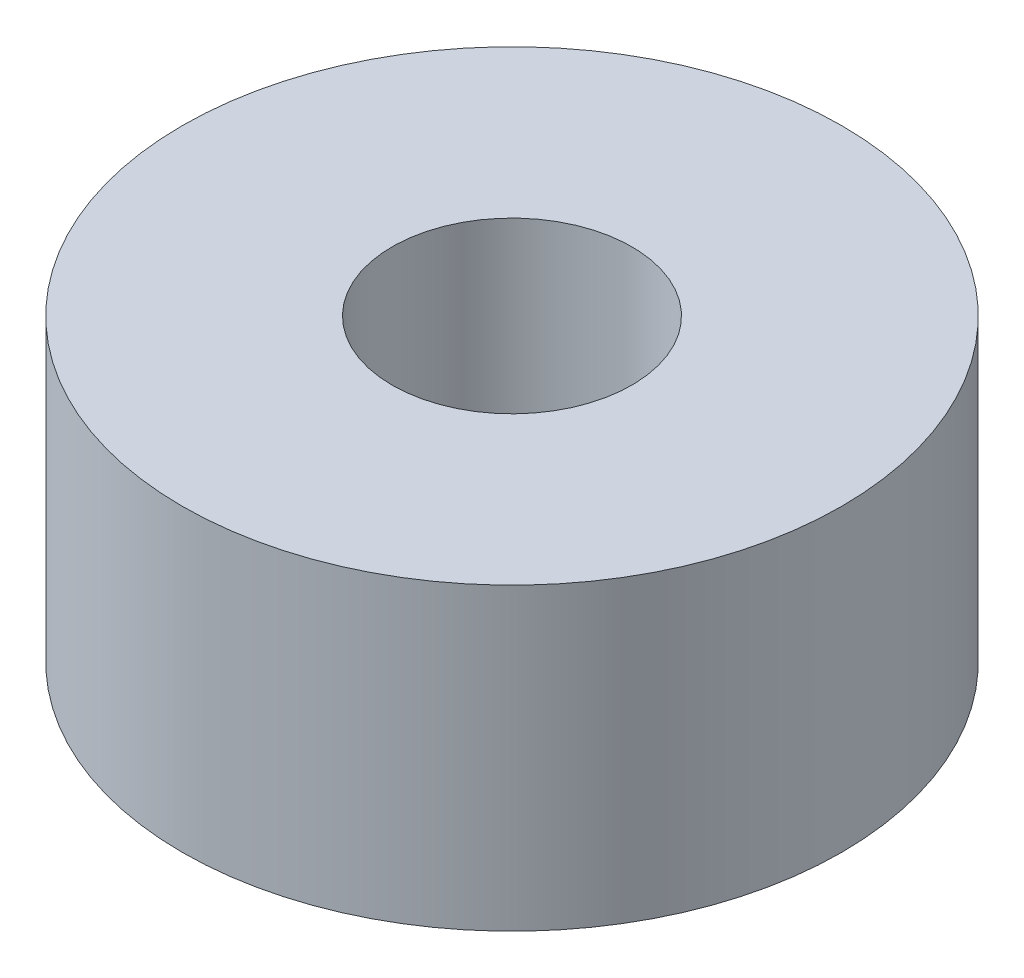
ISO-10303-21;
HEADER;
FILE_DESCRIPTION(('STEP AP214'),'2;1');
FILE_NAME('part.step','',(''),(''),'','','');
FILE_SCHEMA(('AUTOMOTIVE_DESIGN { 1 0 10303 214 1 1 1 1 }'));
ENDSEC;
DATA;
#1=APPLICATION_CONTEXT('core data for automotive mechanical design processes');
#2=APPLICATION_PROTOCOL_DEFINITION('international standard','automotive_design',2000,#1);
#3=PRODUCT_CONTEXT('',#1,'mechanical');
#4=PRODUCT('Part','Part','',(#3));
#5=PRODUCT_RELATED_PRODUCT_CATEGORY('part','',(#4));
#6=PRODUCT_DEFINITION_FORMATION('','',#4);
#7=PRODUCT_DEFINITION_CONTEXT('part definition',#1,'design');
#8=PRODUCT_DEFINITION('design','',#6,#7);
#9=PRODUCT_DEFINITION_SHAPE('','',#8);
#10=(LENGTH_UNIT() NAMED_UNIT(*) SI_UNIT(.MILLI.,.METRE.));
#11=(NAMED_UNIT(*) PLANE_ANGLE_UNIT() SI_UNIT($,.RADIAN.));
#12=(NAMED_UNIT(*) SI_UNIT($,.STERADIAN.) SOLID_ANGLE_UNIT());
#13=UNCERTAINTY_MEASURE_WITH_UNIT(LENGTH_MEASURE(1.E-05),#10,'distance_accuracy_value','');
#14=(GEOMETRIC_REPRESENTATION_CONTEXT(3) GLOBAL_UNCERTAINTY_ASSIGNED_CONTEXT((#13)) GLOBAL_UNIT_ASSIGNED_CONTEXT((#10,
#11,#12)) REPRESENTATION_CONTEXT('',''));
#15=CARTESIAN_POINT('',(0.,0.,0.));
#16=DIRECTION('',(0.,0.,1.));
#17=DIRECTION('',(1.,0.,0.));
#18=AXIS2_PLACEMENT_3D('',#15,#16,#17);
#19=CARTESIAN_POINT('',(0.,10.,0.));
#20=DIRECTION('',(0.,1.,0.));
#21=DIRECTION('',(0.,0.,1.));
#22=AXIS2_PLACEMENT_3D('',#19,#20,#21);
#23=PLANE('',#22);
#24=CARTESIAN_POINT('',(0.,10.,0.));
#25=DIRECTION('',(0.,1.,0.));
#26=DIRECTION('',(0.,0.,1.));
#27=AXIS2_PLACEMENT_3D('',#24,#25,#26);
#28=CIRCLE('',#27,11.);
#29=CARTESIAN_POINT('',(0.,10.,11.));
#30=VERTEX_POINT('',#29);
#31=EDGE_CURVE('E10',#30,#30,#28,.T.);
#32=ORIENTED_EDGE('',*,*,#31,.T.);
#33=EDGE_LOOP('',(#32));
#34=FACE_BOUND('',#33,.T.);
#35=CARTESIAN_POINT('',(0.,10.,0.));
#36=DIRECTION('',(0.,1.,0.));
#37=DIRECTION('',(0.,0.,1.));
#38=AXIS2_PLACEMENT_3D('',#35,#36,#37);
#39=CIRCLE('',#38,4.);
#40=CARTESIAN_POINT('',(0.,10.,4.));
#41=VERTEX_POINT('',#40);
#42=EDGE_CURVE('E53',#41,#41,#39,.T.);
#43=ORIENTED_EDGE('',*,*,#42,.F.);
#44=EDGE_LOOP('',(#43));
#45=FACE_BOUND('',#44,.T.);
#46=ADVANCED_FACE('F40',(#34,#45),#23,.T.);
#47=CARTESIAN_POINT('',(0.,0.,0.));
#48=DIRECTION('',(0.,1.,0.));
#49=DIRECTION('',(0.,0.,1.));
#50=AXIS2_PLACEMENT_3D('',#47,#48,#49);
#51=PLANE('',#50);
#52=CARTESIAN_POINT('',(0.,0.,0.));
#53=DIRECTION('',(0.,1.,0.));
#54=DIRECTION('',(0.,0.,1.));
#55=AXIS2_PLACEMENT_3D('',#52,#53,#54);
#56=CIRCLE('',#55,11.);
#57=CARTESIAN_POINT('',(0.,0.,11.));
#58=VERTEX_POINT('',#57);
#59=EDGE_CURVE('E44',#58,#58,#56,.T.);
#60=ORIENTED_EDGE('',*,*,#59,.F.);
#61=EDGE_LOOP('',(#60));
#62=FACE_BOUND('',#61,.T.);
#63=CARTESIAN_POINT('',(0.,0.,0.));
#64=DIRECTION('',(0.,1.,0.));
#65=DIRECTION('',(0.,0.,1.));
#66=AXIS2_PLACEMENT_3D('',#63,#64,#65);
#67=CIRCLE('',#66,4.);
#68=CARTESIAN_POINT('',(0.,0.,4.));
#69=VERTEX_POINT('',#68);
#70=EDGE_CURVE('E55',#69,#69,#67,.T.);
#71=ORIENTED_EDGE('',*,*,#70,.T.);
#72=EDGE_LOOP('',(#71));
#73=FACE_BOUND('',#72,.T.);
#74=ADVANCED_FACE('F67',(#62,#73),#51,.F.);
#75=CARTESIAN_POINT('',(0.,10.,0.));
#76=DIRECTION('',(0.,-1.,0.));
#77=DIRECTION('',(0.,0.,-1.));
#78=AXIS2_PLACEMENT_3D('',#75,#76,#77);
#79=CYLINDRICAL_SURFACE('',#78,11.);
#80=ORIENTED_EDGE('',*,*,#31,.F.);
#81=EDGE_LOOP('',(#80));
#82=FACE_BOUND('',#81,.T.);
#83=ORIENTED_EDGE('',*,*,#59,.T.);
#84=EDGE_LOOP('',(#83));
#85=FACE_BOUND('',#84,.T.);
#86=ADVANCED_FACE('F42',(#82,#85),#79,.T.);
#87=CARTESIAN_POINT('',(0.,10.,0.));
#88=DIRECTION('',(0.,-1.,0.));
#89=DIRECTION('',(0.,0.,-1.));
#90=AXIS2_PLACEMENT_3D('',#87,#88,#89);
#91=CYLINDRICAL_SURFACE('',#90,4.);
#92=ORIENTED_EDGE('',*,*,#42,.T.);
#93=EDGE_LOOP('',(#92));
#94=FACE_BOUND('',#93,.T.);
#95=ORIENTED_EDGE('',*,*,#70,.F.);
#96=EDGE_LOOP('',(#95));
#97=FACE_BOUND('',#96,.T.);
#98=ADVANCED_FACE('F63',(#94,#97),#91,.F.);
#99=CLOSED_SHELL('',(#46,#74,#86,#98));
#100=MANIFOLD_SOLID_BREP('B2',#99);
#101=ADVANCED_BREP_SHAPE_REPRESENTATION('',(#18,#100),#14);
#102=SHAPE_DEFINITION_REPRESENTATION(#9,#101);
ENDSEC;
END-ISO-10303-21;
